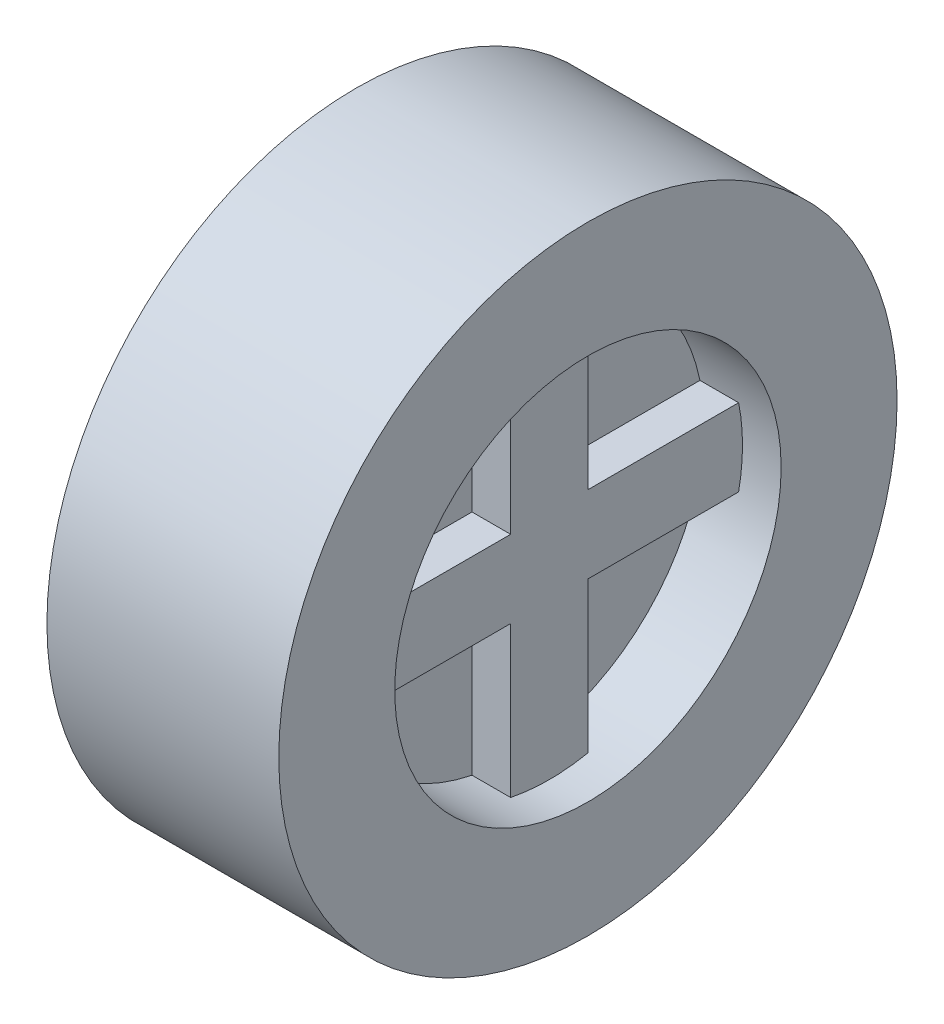
ISO-10303-21;
HEADER;
FILE_DESCRIPTION(('STEP AP214'),'2;1');
FILE_NAME('part.step','',(''),(''),'','','');
FILE_SCHEMA(('AUTOMOTIVE_DESIGN { 1 0 10303 214 1 1 1 1 }'));
ENDSEC;
DATA;
#1=APPLICATION_CONTEXT('core data for automotive mechanical design processes');
#2=APPLICATION_PROTOCOL_DEFINITION('international standard','automotive_design',2000,#1);
#3=PRODUCT_CONTEXT('',#1,'mechanical');
#4=PRODUCT('Part','Part','',(#3));
#5=PRODUCT_RELATED_PRODUCT_CATEGORY('part','',(#4));
#6=PRODUCT_DEFINITION_FORMATION('','',#4);
#7=PRODUCT_DEFINITION_CONTEXT('part definition',#1,'design');
#8=PRODUCT_DEFINITION('design','',#6,#7);
#9=PRODUCT_DEFINITION_SHAPE('','',#8);
#10=(LENGTH_UNIT() NAMED_UNIT(*) SI_UNIT(.MILLI.,.METRE.));
#11=(NAMED_UNIT(*) PLANE_ANGLE_UNIT() SI_UNIT($,.RADIAN.));
#12=(NAMED_UNIT(*) SI_UNIT($,.STERADIAN.) SOLID_ANGLE_UNIT());
#13=UNCERTAINTY_MEASURE_WITH_UNIT(LENGTH_MEASURE(1.E-05),#10,'distance_accuracy_value','');
#14=(GEOMETRIC_REPRESENTATION_CONTEXT(3) GLOBAL_UNCERTAINTY_ASSIGNED_CONTEXT((#13)) GLOBAL_UNIT_ASSIGNED_CONTEXT((#10,
#11,#12)) REPRESENTATION_CONTEXT('',''));
#15=CARTESIAN_POINT('',(0.,0.,0.));
#16=DIRECTION('',(0.,0.,1.));
#17=DIRECTION('',(1.,0.,0.));
#18=AXIS2_PLACEMENT_3D('',#15,#16,#17);
#19=CARTESIAN_POINT('',(2.,0.,0.));
#20=DIRECTION('',(1.,0.,0.));
#21=DIRECTION('',(0.,0.,-1.));
#22=AXIS2_PLACEMENT_3D('',#19,#20,#21);
#23=CYLINDRICAL_SURFACE('',#22,2.5);
#24=CARTESIAN_POINT('',(3.,0.,0.));
#25=DIRECTION('',(1.,0.,0.));
#26=DIRECTION('',(0.,0.,-1.));
#27=AXIS2_PLACEMENT_3D('',#24,#25,#26);
#28=CIRCLE('',#27,2.5);
#29=CARTESIAN_POINT('',(3.,0.,-2.5));
#30=VERTEX_POINT('',#29);
#31=EDGE_CURVE('E248',#30,#30,#28,.T.);
#32=ORIENTED_EDGE('',*,*,#31,.T.);
#33=EDGE_LOOP('',(#32));
#34=FACE_BOUND('',#33,.T.);
#35=DIRECTION('',(-1.,0.,0.));
#36=VECTOR('',#35,1.);
#37=CARTESIAN_POINT('',(2.5,-2.44948974278318,0.500000000000001));
#38=LINE('',#37,#36);
#39=CARTESIAN_POINT('',(2.5,-2.44948974278318,0.500000000000001));
#40=VERTEX_POINT('',#39);
#41=CARTESIAN_POINT('',(2.,-2.44948974278318,0.500000000000001));
#42=VERTEX_POINT('',#41);
#43=EDGE_CURVE('E219',#40,#42,#38,.T.);
#44=ORIENTED_EDGE('',*,*,#43,.T.);
#45=CARTESIAN_POINT('',(2.,0.,0.));
#46=DIRECTION('',(1.,0.,0.));
#47=DIRECTION('',(0.,0.,-1.));
#48=AXIS2_PLACEMENT_3D('',#45,#46,#47);
#49=CIRCLE('',#48,2.5);
#50=CARTESIAN_POINT('',(2.,-0.5,2.44948974278318));
#51=VERTEX_POINT('',#50);
#52=EDGE_CURVE('E261',#51,#42,#49,.T.);
#53=ORIENTED_EDGE('',*,*,#52,.F.);
#54=DIRECTION('',(-1.,0.,0.));
#55=VECTOR('',#54,1.);
#56=CARTESIAN_POINT('',(2.5,-0.5,2.44948974278318));
#57=LINE('',#56,#55);
#58=CARTESIAN_POINT('',(2.5,-0.5,2.44948974278318));
#59=VERTEX_POINT('',#58);
#60=EDGE_CURVE('E230',#59,#51,#57,.T.);
#61=ORIENTED_EDGE('',*,*,#60,.F.);
#62=CARTESIAN_POINT('',(2.5,0.,0.));
#63=DIRECTION('',(1.,0.,0.));
#64=DIRECTION('',(0.,0.,-1.));
#65=AXIS2_PLACEMENT_3D('',#62,#63,#64);
#66=CIRCLE('',#65,2.5);
#67=CARTESIAN_POINT('',(2.5,0.500000000000001,2.44948974278318));
#68=VERTEX_POINT('',#67);
#69=EDGE_CURVE('E290',#68,#59,#66,.T.);
#70=ORIENTED_EDGE('',*,*,#69,.F.);
#71=DIRECTION('',(-1.,0.,0.));
#72=VECTOR('',#71,1.);
#73=CARTESIAN_POINT('',(2.5,0.500000000000001,2.44948974278318));
#74=LINE('',#73,#72);
#75=CARTESIAN_POINT('',(2.,0.500000000000001,2.44948974278318));
#76=VERTEX_POINT('',#75);
#77=EDGE_CURVE('E228',#68,#76,#74,.T.);
#78=ORIENTED_EDGE('',*,*,#77,.T.);
#79=CARTESIAN_POINT('',(2.,2.44948974278318,0.5));
#80=VERTEX_POINT('',#79);
#81=EDGE_CURVE('E252',#80,#76,#49,.T.);
#82=ORIENTED_EDGE('',*,*,#81,.F.);
#83=DIRECTION('',(-1.,0.,0.));
#84=VECTOR('',#83,1.);
#85=CARTESIAN_POINT('',(2.5,2.44948974278318,0.5));
#86=LINE('',#85,#84);
#87=CARTESIAN_POINT('',(2.5,2.44948974278318,0.5));
#88=VERTEX_POINT('',#87);
#89=EDGE_CURVE('E236',#88,#80,#86,.T.);
#90=ORIENTED_EDGE('',*,*,#89,.F.);
#91=CARTESIAN_POINT('',(2.5,0.,0.));
#92=DIRECTION('',(1.,0.,0.));
#93=DIRECTION('',(0.,0.,-1.));
#94=AXIS2_PLACEMENT_3D('',#91,#92,#93);
#95=CIRCLE('',#94,2.5);
#96=CARTESIAN_POINT('',(2.5,2.44948974278318,-0.5));
#97=VERTEX_POINT('',#96);
#98=EDGE_CURVE('E316',#97,#88,#95,.T.);
#99=ORIENTED_EDGE('',*,*,#98,.F.);
#100=DIRECTION('',(-1.,0.,0.));
#101=VECTOR('',#100,1.);
#102=CARTESIAN_POINT('',(2.5,2.44948974278318,-0.5));
#103=LINE('',#102,#101);
#104=CARTESIAN_POINT('',(2.,2.44948974278318,-0.5));
#105=VERTEX_POINT('',#104);
#106=EDGE_CURVE('E209',#97,#105,#103,.T.);
#107=ORIENTED_EDGE('',*,*,#106,.T.);
#108=CARTESIAN_POINT('',(2.,0.5,-2.44948974278318));
#109=VERTEX_POINT('',#108);
#110=EDGE_CURVE('E203',#109,#105,#49,.T.);
#111=ORIENTED_EDGE('',*,*,#110,.F.);
#112=DIRECTION('',(-1.,0.,0.));
#113=VECTOR('',#112,1.);
#114=CARTESIAN_POINT('',(2.5,0.5,-2.44948974278318));
#115=LINE('',#114,#113);
#116=CARTESIAN_POINT('',(2.5,0.5,-2.44948974278318));
#117=VERTEX_POINT('',#116);
#118=EDGE_CURVE('E195',#117,#109,#115,.T.);
#119=ORIENTED_EDGE('',*,*,#118,.F.);
#120=CARTESIAN_POINT('',(2.5,0.,0.));
#121=DIRECTION('',(1.,0.,0.));
#122=DIRECTION('',(0.,0.,-1.));
#123=AXIS2_PLACEMENT_3D('',#120,#121,#122);
#124=CIRCLE('',#123,2.5);
#125=CARTESIAN_POINT('',(2.5,-0.500000000000001,-2.44948974278318));
#126=VERTEX_POINT('',#125);
#127=EDGE_CURVE('E176',#126,#117,#124,.T.);
#128=ORIENTED_EDGE('',*,*,#127,.F.);
#129=DIRECTION('',(-1.,0.,0.));
#130=VECTOR('',#129,1.);
#131=CARTESIAN_POINT('',(2.5,-0.500000000000001,-2.44948974278318));
#132=LINE('',#131,#130);
#133=CARTESIAN_POINT('',(2.,-0.500000000000001,-2.44948974278318));
#134=VERTEX_POINT('',#133);
#135=EDGE_CURVE('E201',#126,#134,#132,.T.);
#136=ORIENTED_EDGE('',*,*,#135,.T.);
#137=CARTESIAN_POINT('',(2.,-2.44948974278318,-0.5));
#138=VERTEX_POINT('',#137);
#139=EDGE_CURVE('E251',#138,#134,#49,.T.);
#140=ORIENTED_EDGE('',*,*,#139,.F.);
#141=DIRECTION('',(-1.,0.,0.));
#142=VECTOR('',#141,1.);
#143=CARTESIAN_POINT('',(2.5,-2.44948974278318,-0.5));
#144=LINE('',#143,#142);
#145=CARTESIAN_POINT('',(2.5,-2.44948974278318,-0.5));
#146=VERTEX_POINT('',#145);
#147=EDGE_CURVE('E220',#146,#138,#144,.T.);
#148=ORIENTED_EDGE('',*,*,#147,.F.);
#149=CARTESIAN_POINT('',(2.5,0.,0.));
#150=DIRECTION('',(1.,0.,0.));
#151=DIRECTION('',(0.,0.,-1.));
#152=AXIS2_PLACEMENT_3D('',#149,#150,#151);
#153=CIRCLE('',#152,2.5);
#154=EDGE_CURVE('E330',#40,#146,#153,.T.);
#155=ORIENTED_EDGE('',*,*,#154,.F.);
#156=EDGE_LOOP('',(#44,#53,#61,#70,#78,#82,#90,#99,#107,#111,#119,#128,#136,#140,#148,#155));
#157=FACE_BOUND('',#156,.T.);
#158=ADVANCED_FACE('F54',(#34,#157),#23,.F.);
#159=CARTESIAN_POINT('',(2.,0.,0.));
#160=DIRECTION('',(1.,0.,0.));
#161=DIRECTION('',(0.,0.,-1.));
#162=AXIS2_PLACEMENT_3D('',#159,#160,#161);
#163=PLANE('',#162);
#164=DIRECTION('',(0.,0.,1.));
#165=VECTOR('',#164,1.);
#166=CARTESIAN_POINT('',(2.,0.5,0.5));
#167=LINE('',#166,#165);
#168=CARTESIAN_POINT('',(2.,0.5,0.5));
#169=VERTEX_POINT('',#168);
#170=EDGE_CURVE('E285',#169,#76,#167,.T.);
#171=ORIENTED_EDGE('',*,*,#170,.F.);
#172=DIRECTION('',(0.,-1.,0.));
#173=VECTOR('',#172,1.);
#174=CARTESIAN_POINT('',(2.,2.44948974278318,0.5));
#175=LINE('',#174,#173);
#176=EDGE_CURVE('E284',#80,#169,#175,.T.);
#177=ORIENTED_EDGE('',*,*,#176,.F.);
#178=ORIENTED_EDGE('',*,*,#81,.T.);
#179=EDGE_LOOP('',(#171,#177,#178));
#180=FACE_BOUND('',#179,.T.);
#181=ADVANCED_FACE('F282',(#180),#163,.T.);
#182=DIRECTION('',(0.,-1.,0.));
#183=VECTOR('',#182,1.);
#184=CARTESIAN_POINT('',(2.,-0.5,0.5));
#185=LINE('',#184,#183);
#186=CARTESIAN_POINT('',(2.,-0.5,0.5));
#187=VERTEX_POINT('',#186);
#188=EDGE_CURVE('E296',#187,#42,#185,.T.);
#189=ORIENTED_EDGE('',*,*,#188,.F.);
#190=DIRECTION('',(0.,0.,-1.));
#191=VECTOR('',#190,1.);
#192=CARTESIAN_POINT('',(2.,-0.5,0.5));
#193=LINE('',#192,#191);
#194=EDGE_CURVE('E293',#51,#187,#193,.T.);
#195=ORIENTED_EDGE('',*,*,#194,.F.);
#196=ORIENTED_EDGE('',*,*,#52,.T.);
#197=EDGE_LOOP('',(#189,#195,#196));
#198=FACE_BOUND('',#197,.T.);
#199=ADVANCED_FACE('F361',(#198),#163,.T.);
#200=DIRECTION('',(0.,0.,-1.));
#201=VECTOR('',#200,1.);
#202=CARTESIAN_POINT('',(2.,-0.5,-0.5));
#203=LINE('',#202,#201);
#204=CARTESIAN_POINT('',(2.,-0.5,-0.5));
#205=VERTEX_POINT('',#204);
#206=EDGE_CURVE('E310',#205,#134,#203,.T.);
#207=ORIENTED_EDGE('',*,*,#206,.F.);
#208=DIRECTION('',(0.,1.,0.));
#209=VECTOR('',#208,1.);
#210=CARTESIAN_POINT('',(2.,-0.5,-0.5));
#211=LINE('',#210,#209);
#212=EDGE_CURVE('E308',#138,#205,#211,.T.);
#213=ORIENTED_EDGE('',*,*,#212,.F.);
#214=ORIENTED_EDGE('',*,*,#139,.T.);
#215=EDGE_LOOP('',(#207,#213,#214));
#216=FACE_BOUND('',#215,.T.);
#217=ADVANCED_FACE('F377',(#216),#163,.T.);
#218=DIRECTION('',(0.,1.,0.));
#219=VECTOR('',#218,1.);
#220=CARTESIAN_POINT('',(2.,2.44948974278318,-0.5));
#221=LINE('',#220,#219);
#222=CARTESIAN_POINT('',(2.,0.5,-0.5));
#223=VERTEX_POINT('',#222);
#224=EDGE_CURVE('E138',#223,#105,#221,.T.);
#225=ORIENTED_EDGE('',*,*,#224,.F.);
#226=DIRECTION('',(0.,0.,1.));
#227=VECTOR('',#226,1.);
#228=CARTESIAN_POINT('',(2.,0.5,-0.5));
#229=LINE('',#228,#227);
#230=EDGE_CURVE('E315',#109,#223,#229,.T.);
#231=ORIENTED_EDGE('',*,*,#230,.F.);
#232=ORIENTED_EDGE('',*,*,#110,.T.);
#233=EDGE_LOOP('',(#225,#231,#232));
#234=FACE_BOUND('',#233,.T.);
#235=ADVANCED_FACE('F364',(#234),#163,.T.);
#236=CARTESIAN_POINT('',(0.,0.,0.));
#237=DIRECTION('',(1.,0.,0.));
#238=DIRECTION('',(0.,0.,-1.));
#239=AXIS2_PLACEMENT_3D('',#236,#237,#238);
#240=PLANE('',#239);
#241=CARTESIAN_POINT('',(0.,0.,0.));
#242=DIRECTION('',(-1.,0.,0.));
#243=DIRECTION('',(0.,0.,1.));
#244=AXIS2_PLACEMENT_3D('',#241,#242,#243);
#245=CIRCLE('',#244,2.5);
#246=CARTESIAN_POINT('',(0.,0.,2.5));
#247=VERTEX_POINT('',#246);
#248=EDGE_CURVE('E242',#247,#247,#245,.T.);
#249=ORIENTED_EDGE('',*,*,#248,.F.);
#250=EDGE_LOOP('',(#249));
#251=FACE_BOUND('',#250,.T.);
#252=CARTESIAN_POINT('',(0.,0.,0.));
#253=DIRECTION('',(1.,0.,0.));
#254=DIRECTION('',(0.,0.,-1.));
#255=AXIS2_PLACEMENT_3D('',#252,#253,#254);
#256=CIRCLE('',#255,4.);
#257=CARTESIAN_POINT('',(0.,0.,-4.));
#258=VERTEX_POINT('',#257);
#259=EDGE_CURVE('E56',#258,#258,#256,.T.);
#260=ORIENTED_EDGE('',*,*,#259,.F.);
#261=EDGE_LOOP('',(#260));
#262=FACE_BOUND('',#261,.T.);
#263=ADVANCED_FACE('F371',(#251,#262),#240,.F.);
#264=CARTESIAN_POINT('',(3.,0.,0.));
#265=DIRECTION('',(-1.,0.,0.));
#266=DIRECTION('',(0.,0.,1.));
#267=AXIS2_PLACEMENT_3D('',#264,#265,#266);
#268=CYLINDRICAL_SURFACE('',#267,4.);
#269=CARTESIAN_POINT('',(3.,0.,0.));
#270=DIRECTION('',(1.,0.,0.));
#271=DIRECTION('',(0.,0.,-1.));
#272=AXIS2_PLACEMENT_3D('',#269,#270,#271);
#273=CIRCLE('',#272,4.);
#274=CARTESIAN_POINT('',(3.,0.,-4.));
#275=VERTEX_POINT('',#274);
#276=EDGE_CURVE('E12',#275,#275,#273,.T.);
#277=ORIENTED_EDGE('',*,*,#276,.F.);
#278=EDGE_LOOP('',(#277));
#279=FACE_BOUND('',#278,.T.);
#280=ORIENTED_EDGE('',*,*,#259,.T.);
#281=EDGE_LOOP('',(#280));
#282=FACE_BOUND('',#281,.T.);
#283=ADVANCED_FACE('F60',(#279,#282),#268,.T.);
#284=CARTESIAN_POINT('',(3.,0.,0.));
#285=DIRECTION('',(1.,0.,0.));
#286=DIRECTION('',(0.,0.,-1.));
#287=AXIS2_PLACEMENT_3D('',#284,#285,#286);
#288=PLANE('',#287);
#289=ORIENTED_EDGE('',*,*,#31,.F.);
#290=EDGE_LOOP('',(#289));
#291=FACE_BOUND('',#290,.T.);
#292=ORIENTED_EDGE('',*,*,#276,.T.);
#293=EDGE_LOOP('',(#292));
#294=FACE_BOUND('',#293,.T.);
#295=ADVANCED_FACE('F366',(#291,#294),#288,.T.);
#296=CARTESIAN_POINT('',(1.,0.,0.));
#297=DIRECTION('',(-1.,0.,0.));
#298=DIRECTION('',(0.,0.,1.));
#299=AXIS2_PLACEMENT_3D('',#296,#297,#298);
#300=CYLINDRICAL_SURFACE('',#299,2.5);
#301=CARTESIAN_POINT('',(1.,0.,0.));
#302=DIRECTION('',(-1.,0.,0.));
#303=DIRECTION('',(0.,0.,1.));
#304=AXIS2_PLACEMENT_3D('',#301,#302,#303);
#305=CIRCLE('',#304,2.5);
#306=CARTESIAN_POINT('',(1.,0.,2.5));
#307=VERTEX_POINT('',#306);
#308=EDGE_CURVE('E245',#307,#307,#305,.T.);
#309=ORIENTED_EDGE('',*,*,#308,.F.);
#310=EDGE_LOOP('',(#309));
#311=FACE_BOUND('',#310,.T.);
#312=ORIENTED_EDGE('',*,*,#248,.T.);
#313=EDGE_LOOP('',(#312));
#314=FACE_BOUND('',#313,.T.);
#315=ADVANCED_FACE('F351',(#311,#314),#300,.F.);
#316=CARTESIAN_POINT('',(1.,0.,0.));
#317=DIRECTION('',(-1.,0.,0.));
#318=DIRECTION('',(0.,0.,1.));
#319=AXIS2_PLACEMENT_3D('',#316,#317,#318);
#320=PLANE('',#319);
#321=ORIENTED_EDGE('',*,*,#308,.T.);
#322=EDGE_LOOP('',(#321));
#323=FACE_BOUND('',#322,.T.);
#324=ADVANCED_FACE('F347',(#323),#320,.T.);
#325=CARTESIAN_POINT('',(2.5,2.44948974278318,0.5));
#326=DIRECTION('',(0.,0.,-1.));
#327=DIRECTION('',(-1.,0.,0.));
#328=AXIS2_PLACEMENT_3D('',#325,#326,#327);
#329=PLANE('',#328);
#330=ORIENTED_EDGE('',*,*,#176,.T.);
#331=DIRECTION('',(-1.,0.,0.));
#332=VECTOR('',#331,1.);
#333=CARTESIAN_POINT('',(2.5,0.5,0.5));
#334=LINE('',#333,#332);
#335=CARTESIAN_POINT('',(2.5,0.5,0.5));
#336=VERTEX_POINT('',#335);
#337=EDGE_CURVE('E235',#336,#169,#334,.T.);
#338=ORIENTED_EDGE('',*,*,#337,.F.);
#339=DIRECTION('',(0.,-1.,0.));
#340=VECTOR('',#339,1.);
#341=CARTESIAN_POINT('',(2.5,2.44948974278318,0.5));
#342=LINE('',#341,#340);
#343=EDGE_CURVE('E148',#88,#336,#342,.T.);
#344=ORIENTED_EDGE('',*,*,#343,.F.);
#345=ORIENTED_EDGE('',*,*,#89,.T.);
#346=EDGE_LOOP('',(#330,#338,#344,#345));
#347=FACE_BOUND('',#346,.T.);
#348=ADVANCED_FACE('F345',(#347),#329,.F.);
#349=CARTESIAN_POINT('',(2.5,0.5,0.5));
#350=DIRECTION('',(0.,-1.,0.));
#351=DIRECTION('',(0.,0.,-1.));
#352=AXIS2_PLACEMENT_3D('',#349,#350,#351);
#353=PLANE('',#352);
#354=ORIENTED_EDGE('',*,*,#170,.T.);
#355=ORIENTED_EDGE('',*,*,#77,.F.);
#356=DIRECTION('',(0.,0.,1.));
#357=VECTOR('',#356,1.);
#358=CARTESIAN_POINT('',(2.5,0.5,0.5));
#359=LINE('',#358,#357);
#360=EDGE_CURVE('E291',#336,#68,#359,.T.);
#361=ORIENTED_EDGE('',*,*,#360,.F.);
#362=ORIENTED_EDGE('',*,*,#337,.T.);
#363=EDGE_LOOP('',(#354,#355,#361,#362));
#364=FACE_BOUND('',#363,.T.);
#365=ADVANCED_FACE('F295',(#364),#353,.F.);
#366=CARTESIAN_POINT('',(2.5,-0.5,0.5));
#367=DIRECTION('',(0.,1.,0.));
#368=DIRECTION('',(0.,0.,1.));
#369=AXIS2_PLACEMENT_3D('',#366,#367,#368);
#370=PLANE('',#369);
#371=ORIENTED_EDGE('',*,*,#194,.T.);
#372=DIRECTION('',(-1.,0.,0.));
#373=VECTOR('',#372,1.);
#374=CARTESIAN_POINT('',(2.5,-0.5,0.5));
#375=LINE('',#374,#373);
#376=CARTESIAN_POINT('',(2.5,-0.5,0.5));
#377=VERTEX_POINT('',#376);
#378=EDGE_CURVE('E224',#377,#187,#375,.T.);
#379=ORIENTED_EDGE('',*,*,#378,.F.);
#380=DIRECTION('',(0.,0.,-1.));
#381=VECTOR('',#380,1.);
#382=CARTESIAN_POINT('',(2.5,-0.5,0.5));
#383=LINE('',#382,#381);
#384=EDGE_CURVE('E334',#59,#377,#383,.T.);
#385=ORIENTED_EDGE('',*,*,#384,.F.);
#386=ORIENTED_EDGE('',*,*,#60,.T.);
#387=EDGE_LOOP('',(#371,#379,#385,#386));
#388=FACE_BOUND('',#387,.T.);
#389=ADVANCED_FACE('F355',(#388),#370,.F.);
#390=CARTESIAN_POINT('',(2.5,-0.5,0.5));
#391=DIRECTION('',(0.,0.,-1.));
#392=DIRECTION('',(-1.,0.,0.));
#393=AXIS2_PLACEMENT_3D('',#390,#391,#392);
#394=PLANE('',#393);
#395=ORIENTED_EDGE('',*,*,#188,.T.);
#396=ORIENTED_EDGE('',*,*,#43,.F.);
#397=DIRECTION('',(0.,-1.,0.));
#398=VECTOR('',#397,1.);
#399=CARTESIAN_POINT('',(2.5,-0.5,0.5));
#400=LINE('',#399,#398);
#401=EDGE_CURVE('E329',#377,#40,#400,.T.);
#402=ORIENTED_EDGE('',*,*,#401,.F.);
#403=ORIENTED_EDGE('',*,*,#378,.T.);
#404=EDGE_LOOP('',(#395,#396,#402,#403));
#405=FACE_BOUND('',#404,.T.);
#406=ADVANCED_FACE('F416',(#405),#394,.F.);
#407=CARTESIAN_POINT('',(2.5,-0.5,-0.5));
#408=DIRECTION('',(0.,0.,1.));
#409=DIRECTION('',(1.,0.,0.));
#410=AXIS2_PLACEMENT_3D('',#407,#408,#409);
#411=PLANE('',#410);
#412=ORIENTED_EDGE('',*,*,#212,.T.);
#413=DIRECTION('',(-1.,0.,0.));
#414=VECTOR('',#413,1.);
#415=CARTESIAN_POINT('',(2.5,-0.5,-0.5));
#416=LINE('',#415,#414);
#417=CARTESIAN_POINT('',(2.5,-0.5,-0.5));
#418=VERTEX_POINT('',#417);
#419=EDGE_CURVE('E208',#418,#205,#416,.T.);
#420=ORIENTED_EDGE('',*,*,#419,.F.);
#421=DIRECTION('',(0.,1.,0.));
#422=VECTOR('',#421,1.);
#423=CARTESIAN_POINT('',(2.5,-0.5,-0.5));
#424=LINE('',#423,#422);
#425=EDGE_CURVE('E322',#146,#418,#424,.T.);
#426=ORIENTED_EDGE('',*,*,#425,.F.);
#427=ORIENTED_EDGE('',*,*,#147,.T.);
#428=EDGE_LOOP('',(#412,#420,#426,#427));
#429=FACE_BOUND('',#428,.T.);
#430=ADVANCED_FACE('F413',(#429),#411,.F.);
#431=CARTESIAN_POINT('',(2.5,-0.5,-0.5));
#432=DIRECTION('',(0.,1.,0.));
#433=DIRECTION('',(0.,0.,1.));
#434=AXIS2_PLACEMENT_3D('',#431,#432,#433);
#435=PLANE('',#434);
#436=ORIENTED_EDGE('',*,*,#206,.T.);
#437=ORIENTED_EDGE('',*,*,#135,.F.);
#438=DIRECTION('',(0.,0.,-1.));
#439=VECTOR('',#438,1.);
#440=CARTESIAN_POINT('',(2.5,-0.5,-0.5));
#441=LINE('',#440,#439);
#442=EDGE_CURVE('E183',#418,#126,#441,.T.);
#443=ORIENTED_EDGE('',*,*,#442,.F.);
#444=ORIENTED_EDGE('',*,*,#419,.T.);
#445=EDGE_LOOP('',(#436,#437,#443,#444));
#446=FACE_BOUND('',#445,.T.);
#447=ADVANCED_FACE('F403',(#446),#435,.F.);
#448=CARTESIAN_POINT('',(2.5,0.5,-0.5));
#449=DIRECTION('',(0.,-1.,0.));
#450=DIRECTION('',(0.,0.,-1.));
#451=AXIS2_PLACEMENT_3D('',#448,#449,#450);
#452=PLANE('',#451);
#453=ORIENTED_EDGE('',*,*,#230,.T.);
#454=DIRECTION('',(-1.,0.,0.));
#455=VECTOR('',#454,1.);
#456=CARTESIAN_POINT('',(2.5,0.5,-0.5));
#457=LINE('',#456,#455);
#458=CARTESIAN_POINT('',(2.5,0.5,-0.5));
#459=VERTEX_POINT('',#458);
#460=EDGE_CURVE('E73',#459,#223,#457,.T.);
#461=ORIENTED_EDGE('',*,*,#460,.F.);
#462=DIRECTION('',(0.,0.,1.));
#463=VECTOR('',#462,1.);
#464=CARTESIAN_POINT('',(2.5,0.5,-0.5));
#465=LINE('',#464,#463);
#466=EDGE_CURVE('E181',#117,#459,#465,.T.);
#467=ORIENTED_EDGE('',*,*,#466,.F.);
#468=ORIENTED_EDGE('',*,*,#118,.T.);
#469=EDGE_LOOP('',(#453,#461,#467,#468));
#470=FACE_BOUND('',#469,.T.);
#471=ADVANCED_FACE('F192',(#470),#452,.F.);
#472=CARTESIAN_POINT('',(2.5,2.44948974278318,-0.5));
#473=DIRECTION('',(0.,0.,1.));
#474=DIRECTION('',(1.,0.,0.));
#475=AXIS2_PLACEMENT_3D('',#472,#473,#474);
#476=PLANE('',#475);
#477=ORIENTED_EDGE('',*,*,#224,.T.);
#478=ORIENTED_EDGE('',*,*,#106,.F.);
#479=DIRECTION('',(0.,1.,0.));
#480=VECTOR('',#479,1.);
#481=CARTESIAN_POINT('',(2.5,2.44948974278318,-0.5));
#482=LINE('',#481,#480);
#483=EDGE_CURVE('E81',#459,#97,#482,.T.);
#484=ORIENTED_EDGE('',*,*,#483,.F.);
#485=ORIENTED_EDGE('',*,*,#460,.T.);
#486=EDGE_LOOP('',(#477,#478,#484,#485));
#487=FACE_BOUND('',#486,.T.);
#488=ADVANCED_FACE('F391',(#487),#476,.F.);
#489=CARTESIAN_POINT('',(2.5,0.,0.));
#490=DIRECTION('',(1.,0.,0.));
#491=DIRECTION('',(0.,0.,-1.));
#492=AXIS2_PLACEMENT_3D('',#489,#490,#491);
#493=PLANE('',#492);
#494=ORIENTED_EDGE('',*,*,#98,.T.);
#495=ORIENTED_EDGE('',*,*,#343,.T.);
#496=ORIENTED_EDGE('',*,*,#360,.T.);
#497=ORIENTED_EDGE('',*,*,#69,.T.);
#498=ORIENTED_EDGE('',*,*,#384,.T.);
#499=ORIENTED_EDGE('',*,*,#401,.T.);
#500=ORIENTED_EDGE('',*,*,#154,.T.);
#501=ORIENTED_EDGE('',*,*,#425,.T.);
#502=ORIENTED_EDGE('',*,*,#442,.T.);
#503=ORIENTED_EDGE('',*,*,#127,.T.);
#504=ORIENTED_EDGE('',*,*,#466,.T.);
#505=ORIENTED_EDGE('',*,*,#483,.T.);
#506=EDGE_LOOP('',(#494,#495,#496,#497,#498,#499,#500,#501,#502,#503,#504,#505));
#507=FACE_BOUND('',#506,.T.);
#508=ADVANCED_FACE('F185',(#507),#493,.T.);
#509=CLOSED_SHELL('',(#158,#181,#199,#217,#235,#263,#283,#295,#315,#324,#348,#365,#389,#406,
#430,#447,#471,#488,#508));
#510=MANIFOLD_SOLID_BREP('B2',#509);
#511=ADVANCED_BREP_SHAPE_REPRESENTATION('',(#18,#510),#14);
#512=SHAPE_DEFINITION_REPRESENTATION(#9,#511);
ENDSEC;
END-ISO-10303-21;
